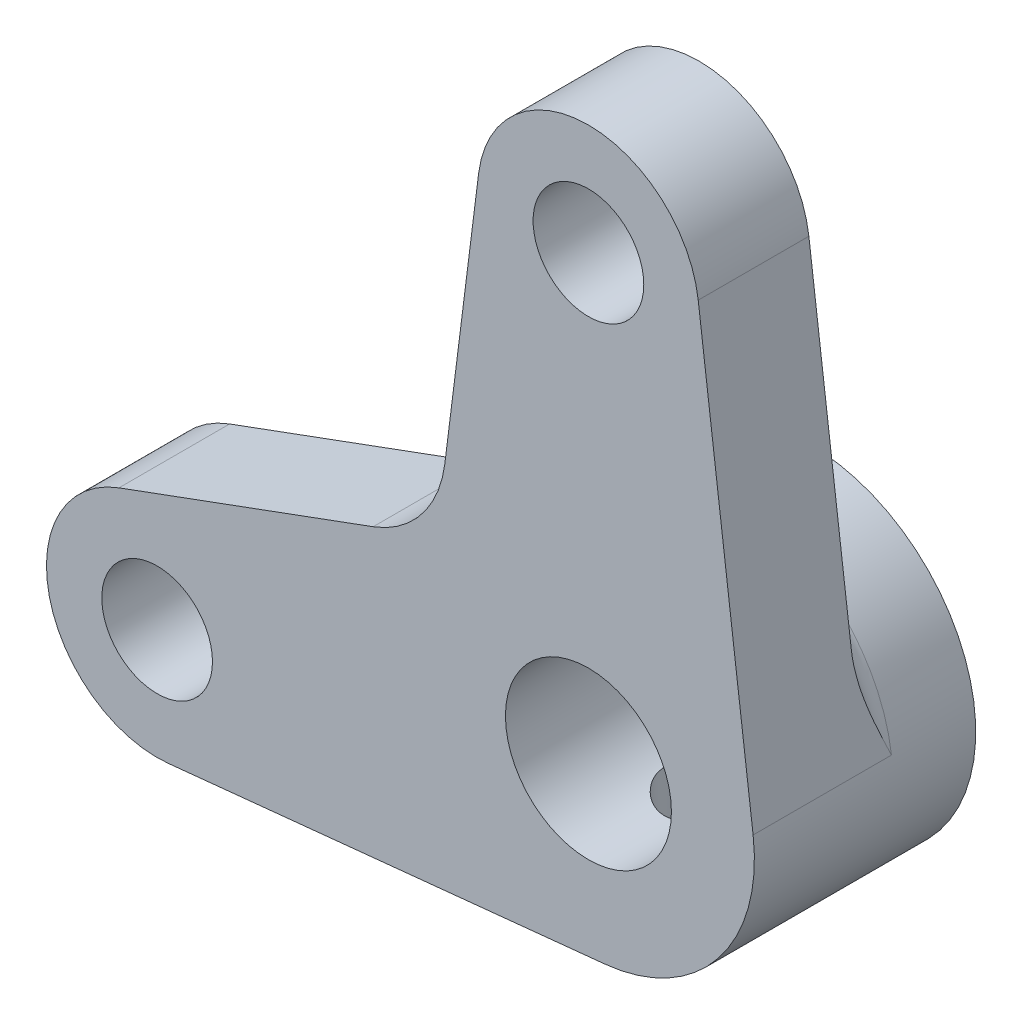
ISO-10303-21;
HEADER;
FILE_DESCRIPTION(('STEP AP214'),'2;1');
FILE_NAME('part.step','',(''),(''),'','','');
FILE_SCHEMA(('AUTOMOTIVE_DESIGN { 1 0 10303 214 1 1 1 1 }'));
ENDSEC;
DATA;
#1=APPLICATION_CONTEXT('core data for automotive mechanical design processes');
#2=APPLICATION_PROTOCOL_DEFINITION('international standard','automotive_design',2000,#1);
#3=PRODUCT_CONTEXT('',#1,'mechanical');
#4=PRODUCT('Part','Part','',(#3));
#5=PRODUCT_RELATED_PRODUCT_CATEGORY('part','',(#4));
#6=PRODUCT_DEFINITION_FORMATION('','',#4);
#7=PRODUCT_DEFINITION_CONTEXT('part definition',#1,'design');
#8=PRODUCT_DEFINITION('design','',#6,#7);
#9=PRODUCT_DEFINITION_SHAPE('','',#8);
#10=(LENGTH_UNIT() NAMED_UNIT(*) SI_UNIT(.MILLI.,.METRE.));
#11=(NAMED_UNIT(*) PLANE_ANGLE_UNIT() SI_UNIT($,.RADIAN.));
#12=(NAMED_UNIT(*) SI_UNIT($,.STERADIAN.) SOLID_ANGLE_UNIT());
#13=UNCERTAINTY_MEASURE_WITH_UNIT(LENGTH_MEASURE(1.E-05),#10,'distance_accuracy_value','');
#14=(GEOMETRIC_REPRESENTATION_CONTEXT(3) GLOBAL_UNCERTAINTY_ASSIGNED_CONTEXT((#13)) GLOBAL_UNIT_ASSIGNED_CONTEXT((#10,
#11,#12)) REPRESENTATION_CONTEXT('',''));
#15=CARTESIAN_POINT('',(0.,0.,0.));
#16=DIRECTION('',(0.,0.,1.));
#17=DIRECTION('',(1.,0.,0.));
#18=AXIS2_PLACEMENT_3D('',#15,#16,#17);
#19=CARTESIAN_POINT('',(-15.5899210365637,-3.5992168695019,4.));
#20=DIRECTION('',(0.,0.,1.));
#21=DIRECTION('',(1.,0.,0.));
#22=AXIS2_PLACEMENT_3D('',#19,#20,#21);
#23=PLANE('',#22);
#24=CARTESIAN_POINT('',(0.,0.,4.));
#25=DIRECTION('',(0.,0.,1.));
#26=DIRECTION('',(1.,0.,0.));
#27=AXIS2_PLACEMENT_3D('',#24,#25,#26);
#28=CIRCLE('',#27,3.);
#29=CARTESIAN_POINT('',(3.,0.,4.));
#30=VERTEX_POINT('',#29);
#31=EDGE_CURVE('E294',#30,#30,#28,.T.);
#32=ORIENTED_EDGE('',*,*,#31,.F.);
#33=EDGE_LOOP('',(#32));
#34=FACE_BOUND('',#33,.T.);
#35=CARTESIAN_POINT('',(-15.5899210365637,-3.5992168695019,4.));
#36=DIRECTION('',(0.,0.,1.));
#37=DIRECTION('',(1.,0.,0.));
#38=AXIS2_PLACEMENT_3D('',#35,#36,#37);
#39=CIRCLE('',#38,4.);
#40=CARTESIAN_POINT('',(-16.9698528893898,0.155218917877603,4.));
#41=VERTEX_POINT('',#40);
#42=CARTESIAN_POINT('',(-15.1843592485229,-7.57860371122527,4.));
#43=VERTEX_POINT('',#42);
#44=EDGE_CURVE('E254',#41,#43,#39,.T.);
#45=ORIENTED_EDGE('',*,*,#44,.T.);
#46=DIRECTION('',(0.994846710430843,0.101390447010215,0.));
#47=VECTOR('',#46,1.);
#48=CARTESIAN_POINT('',(-15.1843592485229,-7.57860371122527,4.));
#49=LINE('',#48,#47);
#50=CARTESIAN_POINT('',(0.60834268206129,-5.96908026258506,4.));
#51=VERTEX_POINT('',#50);
#52=EDGE_CURVE('E289',#43,#51,#49,.T.);
#53=ORIENTED_EDGE('',*,*,#52,.T.);
#54=CARTESIAN_POINT('',(0.,0.,4.));
#55=DIRECTION('',(0.,0.,1.));
#56=DIRECTION('',(1.,0.,0.));
#57=AXIS2_PLACEMENT_3D('',#54,#55,#56);
#58=CIRCLE('',#57,6.);
#59=CARTESIAN_POINT('',(5.95294044989533,0.75,4.));
#60=VERTEX_POINT('',#59);
#61=EDGE_CURVE('E138',#51,#60,#58,.T.);
#62=ORIENTED_EDGE('',*,*,#61,.T.);
#63=DIRECTION('',(-0.125,0.992156741649221,0.));
#64=VECTOR('',#63,1.);
#65=CARTESIAN_POINT('',(3.96862696659688,16.5,4.));
#66=LINE('',#65,#64);
#67=CARTESIAN_POINT('',(3.96862696659688,16.5,4.));
#68=VERTEX_POINT('',#67);
#69=EDGE_CURVE('E286',#60,#68,#66,.T.);
#70=ORIENTED_EDGE('',*,*,#69,.T.);
#71=CARTESIAN_POINT('',(0.,16.,4.));
#72=DIRECTION('',(0.,0.,1.));
#73=DIRECTION('',(1.,0.,0.));
#74=AXIS2_PLACEMENT_3D('',#71,#72,#73);
#75=CIRCLE('',#74,4.);
#76=CARTESIAN_POINT('',(-3.96862696659688,16.5,4.));
#77=VERTEX_POINT('',#76);
#78=EDGE_CURVE('E269',#68,#77,#75,.T.);
#79=ORIENTED_EDGE('',*,*,#78,.T.);
#80=DIRECTION('',(-0.125,-0.992156741649221,0.));
#81=VECTOR('',#80,1.);
#82=CARTESIAN_POINT('',(-3.96862696659688,16.5,4.));
#83=LINE('',#82,#81);
#84=CARTESIAN_POINT('',(-5.19235336997923,6.78697279160037,4.));
#85=VERTEX_POINT('',#84);
#86=EDGE_CURVE('E282',#77,#85,#83,.T.);
#87=ORIENTED_EDGE('',*,*,#86,.T.);
#88=CARTESIAN_POINT('',(-9.16098033657612,7.28697279160036,4.));
#89=DIRECTION('',(0.,0.,-1.));
#90=DIRECTION('',(-1.,0.,0.));
#91=AXIS2_PLACEMENT_3D('',#88,#89,#90);
#92=CIRCLE('',#91,4.);
#93=CARTESIAN_POINT('',(-7.78104848375004,3.53253700422085,4.));
#94=VERTEX_POINT('',#93);
#95=EDGE_CURVE('E279',#85,#94,#92,.T.);
#96=ORIENTED_EDGE('',*,*,#95,.T.);
#97=DIRECTION('',(-0.938608946844875,-0.344982963206524,0.));
#98=VECTOR('',#97,1.);
#99=CARTESIAN_POINT('',(-16.9698528893898,0.155218917877603,4.));
#100=LINE('',#99,#98);
#101=EDGE_CURVE('E242',#94,#41,#100,.T.);
#102=ORIENTED_EDGE('',*,*,#101,.T.);
#103=EDGE_LOOP('',(#45,#53,#62,#70,#79,#87,#96,#102));
#104=FACE_BOUND('',#103,.T.);
#105=CARTESIAN_POINT('',(-15.5899210365637,-3.5992168695019,4.));
#106=DIRECTION('',(0.,0.,1.));
#107=DIRECTION('',(1.,0.,0.));
#108=AXIS2_PLACEMENT_3D('',#105,#106,#107);
#109=CIRCLE('',#108,2.);
#110=CARTESIAN_POINT('',(-13.5899210365637,-3.5992168695019,4.));
#111=VERTEX_POINT('',#110);
#112=EDGE_CURVE('E234',#111,#111,#109,.T.);
#113=ORIENTED_EDGE('',*,*,#112,.F.);
#114=EDGE_LOOP('',(#113));
#115=FACE_BOUND('',#114,.T.);
#116=CARTESIAN_POINT('',(0.,16.,4.));
#117=DIRECTION('',(0.,0.,1.));
#118=DIRECTION('',(1.,0.,0.));
#119=AXIS2_PLACEMENT_3D('',#116,#117,#118);
#120=CIRCLE('',#119,2.);
#121=CARTESIAN_POINT('',(2.,16.,4.));
#122=VERTEX_POINT('',#121);
#123=EDGE_CURVE('E298',#122,#122,#120,.T.);
#124=ORIENTED_EDGE('',*,*,#123,.F.);
#125=EDGE_LOOP('',(#124));
#126=FACE_BOUND('',#125,.T.);
#127=ADVANCED_FACE('F36',(#34,#104,#115,#126),#23,.T.);
#128=CARTESIAN_POINT('',(-15.5899210365637,-3.5992168695019,0.));
#129=DIRECTION('',(0.,0.,1.));
#130=DIRECTION('',(1.,0.,0.));
#131=AXIS2_PLACEMENT_3D('',#128,#129,#130);
#132=PLANE('',#131);
#133=DIRECTION('',(-0.125,0.992156741649221,0.));
#134=VECTOR('',#133,1.);
#135=CARTESIAN_POINT('',(3.96862696659688,16.5,0.));
#136=LINE('',#135,#134);
#137=CARTESIAN_POINT('',(5.50224654046233,4.32727200531355,0.));
#138=VERTEX_POINT('',#137);
#139=CARTESIAN_POINT('',(3.96862696659688,16.5,0.));
#140=VERTEX_POINT('',#139);
#141=EDGE_CURVE('E236',#138,#140,#136,.T.);
#142=ORIENTED_EDGE('',*,*,#141,.F.);
#143=CARTESIAN_POINT('',(0.,0.,0.));
#144=DIRECTION('',(0.,0.,1.));
#145=DIRECTION('',(1.,0.,0.));
#146=AXIS2_PLACEMENT_3D('',#143,#144,#145);
#147=CIRCLE('',#146,7.);
#148=CARTESIAN_POINT('',(-2.97862814362378,-6.3346487181226,0.));
#149=VERTEX_POINT('',#148);
#150=EDGE_CURVE('E213',#138,#149,#147,.T.);
#151=ORIENTED_EDGE('',*,*,#150,.T.);
#152=DIRECTION('',(0.994846710430843,0.101390447010215,0.));
#153=VECTOR('',#152,1.);
#154=CARTESIAN_POINT('',(-15.1843592485229,-7.57860371122527,0.));
#155=LINE('',#154,#153);
#156=CARTESIAN_POINT('',(-15.1843592485229,-7.57860371122527,0.));
#157=VERTEX_POINT('',#156);
#158=EDGE_CURVE('E233',#157,#149,#155,.T.);
#159=ORIENTED_EDGE('',*,*,#158,.F.);
#160=CARTESIAN_POINT('',(-15.5899210365637,-3.5992168695019,0.));
#161=DIRECTION('',(0.,0.,1.));
#162=DIRECTION('',(1.,0.,0.));
#163=AXIS2_PLACEMENT_3D('',#160,#161,#162);
#164=CIRCLE('',#163,4.);
#165=CARTESIAN_POINT('',(-16.9698528893898,0.155218917877603,0.));
#166=VERTEX_POINT('',#165);
#167=EDGE_CURVE('E228',#166,#157,#164,.T.);
#168=ORIENTED_EDGE('',*,*,#167,.F.);
#169=DIRECTION('',(-0.938608946844875,-0.344982963206524,0.));
#170=VECTOR('',#169,1.);
#171=CARTESIAN_POINT('',(-16.9698528893898,0.155218917877603,0.));
#172=LINE('',#171,#170);
#173=CARTESIAN_POINT('',(-7.78104848375004,3.53253700422085,0.));
#174=VERTEX_POINT('',#173);
#175=EDGE_CURVE('E252',#174,#166,#172,.T.);
#176=ORIENTED_EDGE('',*,*,#175,.F.);
#177=CARTESIAN_POINT('',(-9.16098033657612,7.28697279160036,0.));
#178=DIRECTION('',(0.,0.,-1.));
#179=DIRECTION('',(-1.,0.,0.));
#180=AXIS2_PLACEMENT_3D('',#177,#178,#179);
#181=CIRCLE('',#180,4.);
#182=CARTESIAN_POINT('',(-5.19235336997923,6.78697279160037,0.));
#183=VERTEX_POINT('',#182);
#184=EDGE_CURVE('E250',#183,#174,#181,.T.);
#185=ORIENTED_EDGE('',*,*,#184,.F.);
#186=DIRECTION('',(-0.125,-0.992156741649221,0.));
#187=VECTOR('',#186,1.);
#188=CARTESIAN_POINT('',(-3.96862696659688,16.5,0.));
#189=LINE('',#188,#187);
#190=CARTESIAN_POINT('',(-3.96862696659688,16.5,0.));
#191=VERTEX_POINT('',#190);
#192=EDGE_CURVE('E248',#191,#183,#189,.T.);
#193=ORIENTED_EDGE('',*,*,#192,.F.);
#194=CARTESIAN_POINT('',(0.,16.,0.));
#195=DIRECTION('',(0.,0.,1.));
#196=DIRECTION('',(1.,0.,0.));
#197=AXIS2_PLACEMENT_3D('',#194,#195,#196);
#198=CIRCLE('',#197,4.);
#199=EDGE_CURVE('E246',#140,#191,#198,.T.);
#200=ORIENTED_EDGE('',*,*,#199,.F.);
#201=EDGE_LOOP('',(#142,#151,#159,#168,#176,#185,#193,#200));
#202=FACE_BOUND('',#201,.T.);
#203=CARTESIAN_POINT('',(-15.5899210365637,-3.5992168695019,0.));
#204=DIRECTION('',(0.,0.,1.));
#205=DIRECTION('',(1.,0.,0.));
#206=AXIS2_PLACEMENT_3D('',#203,#204,#205);
#207=CIRCLE('',#206,2.);
#208=CARTESIAN_POINT('',(-13.5899210365637,-3.5992168695019,0.));
#209=VERTEX_POINT('',#208);
#210=EDGE_CURVE('E239',#209,#209,#207,.T.);
#211=ORIENTED_EDGE('',*,*,#210,.T.);
#212=EDGE_LOOP('',(#211));
#213=FACE_BOUND('',#212,.T.);
#214=CARTESIAN_POINT('',(0.,16.,0.));
#215=DIRECTION('',(0.,0.,1.));
#216=DIRECTION('',(1.,0.,0.));
#217=AXIS2_PLACEMENT_3D('',#214,#215,#216);
#218=CIRCLE('',#217,2.);
#219=CARTESIAN_POINT('',(2.,16.,0.));
#220=VERTEX_POINT('',#219);
#221=EDGE_CURVE('E299',#220,#220,#218,.T.);
#222=ORIENTED_EDGE('',*,*,#221,.T.);
#223=EDGE_LOOP('',(#222));
#224=FACE_BOUND('',#223,.T.);
#225=ADVANCED_FACE('F185',(#202,#213,#224),#132,.F.);
#226=CARTESIAN_POINT('',(-15.5899210365637,-3.5992168695019,4.));
#227=DIRECTION('',(0.,0.,-1.));
#228=DIRECTION('',(-1.,0.,0.));
#229=AXIS2_PLACEMENT_3D('',#226,#227,#228);
#230=CYLINDRICAL_SURFACE('',#229,4.);
#231=ORIENTED_EDGE('',*,*,#167,.T.);
#232=DIRECTION('',(0.,0.,-1.));
#233=VECTOR('',#232,1.);
#234=CARTESIAN_POINT('',(-15.1843592485229,-7.57860371122527,4.));
#235=LINE('',#234,#233);
#236=EDGE_CURVE('E124',#43,#157,#235,.T.);
#237=ORIENTED_EDGE('',*,*,#236,.F.);
#238=ORIENTED_EDGE('',*,*,#44,.F.);
#239=DIRECTION('',(0.,0.,-1.));
#240=VECTOR('',#239,1.);
#241=CARTESIAN_POINT('',(-16.9698528893898,0.155218917877603,4.));
#242=LINE('',#241,#240);
#243=EDGE_CURVE('E231',#41,#166,#242,.T.);
#244=ORIENTED_EDGE('',*,*,#243,.T.);
#245=EDGE_LOOP('',(#231,#237,#238,#244));
#246=FACE_BOUND('',#245,.T.);
#247=ADVANCED_FACE('F189',(#246),#230,.T.);
#248=CARTESIAN_POINT('',(-15.1843592485229,-7.57860371122527,4.));
#249=DIRECTION('',(-0.101390447010215,0.994846710430843,0.));
#250=DIRECTION('',(-0.994846710430843,-0.101390447010215,0.));
#251=AXIS2_PLACEMENT_3D('',#248,#249,#250);
#252=PLANE('',#251);
#253=ORIENTED_EDGE('',*,*,#158,.T.);
#254=CARTESIAN_POINT('',(-2.97862814362378,-6.3346487181226,0.));
#255=CARTESIAN_POINT('',(-2.90308294799251,-6.32694948056749,-1.56209985693339E-05));
#256=CARTESIAN_POINT('',(-2.8275688274235,-6.31925341004748,-0.00229374645395398));
#257=CARTESIAN_POINT('',(-2.67681403400505,-6.30388913760896,-0.01085341015607));
#258=CARTESIAN_POINT('',(-2.60157320678209,-6.29622091995736,-0.0171321458043487));
#259=CARTESIAN_POINT('',(-2.45187039275266,-6.2809638606798,-0.0331301338563641));
#260=CARTESIAN_POINT('',(-2.37740639231187,-6.27337481383299,-0.0428308585833424));
#261=CARTESIAN_POINT('',(-2.228924484977,-6.25824218405217,-0.0652627946849682));
#262=CARTESIAN_POINT('',(-2.15490666131349,-6.25069860960067,-0.0779945545678533));
#263=CARTESIAN_POINT('',(-1.93427000150934,-6.22821228147611,-0.12004284567006));
#264=CARTESIAN_POINT('',(-1.78838482640824,-6.21334429934321,-0.15329246027527));
#265=CARTESIAN_POINT('',(-1.57075541785353,-6.191164457178,-0.209314468864952));
#266=CARTESIAN_POINT('',(-1.49820999541681,-6.18377094345143,-0.229077294990475));
#267=CARTESIAN_POINT('',(-1.35365131716599,-6.1690381521044,-0.270382961007596));
#268=CARTESIAN_POINT('',(-1.28163786869547,-6.16169885484924,-0.29192511821995));
#269=CARTESIAN_POINT('',(-1.20985768307441,-6.1543833307285,-0.314236195728357));
#270=B_SPLINE_CURVE_WITH_KNOTS('',3,(#254,#255,#256,#257,#258,#259,#260,#261,#262,#263,#264,
#265,#266,#267,#268,#269),.UNSPECIFIED.,.F.,.F.,(4,2,2,2,2,2,2,4),(0.,0.227731108736886,
0.45530285723825,0.681660911877761,0.908059960354492,1.35878919478755,1.58543029179668,
1.81198483335537),.UNSPECIFIED.);
#271=CARTESIAN_POINT('',(-1.20985768307441,-6.1543833307285,-0.314236195728356));
#272=VERTEX_POINT('',#271);
#273=EDGE_CURVE('E50',#149,#272,#270,.T.);
#274=ORIENTED_EDGE('',*,*,#273,.T.);
#275=CARTESIAN_POINT('',(0.,-6.03107990114533,0.));
#276=DIRECTION('',(-0.101390447010215,0.994846710430843,0.));
#277=DIRECTION('',(-0.994846710430843,-0.101390447010215,0.));
#278=AXIS2_PLACEMENT_3D('',#275,#276,#277);
#279=ELLIPSE('',#278,1.25647497940528,1.25);
#280=CARTESIAN_POINT('',(0.60834268206129,-5.96908026258506,1.09197947837058));
#281=VERTEX_POINT('',#280);
#282=EDGE_CURVE('E56',#272,#281,#279,.T.);
#283=ORIENTED_EDGE('',*,*,#282,.T.);
#284=DIRECTION('',(0.,0.,-1.));
#285=VECTOR('',#284,1.);
#286=CARTESIAN_POINT('',(0.60834268206129,-5.96908026258506,4.));
#287=LINE('',#286,#285);
#288=EDGE_CURVE('E130',#51,#281,#287,.T.);
#289=ORIENTED_EDGE('',*,*,#288,.F.);
#290=ORIENTED_EDGE('',*,*,#52,.F.);
#291=ORIENTED_EDGE('',*,*,#236,.T.);
#292=EDGE_LOOP('',(#253,#274,#283,#289,#290,#291));
#293=FACE_BOUND('',#292,.T.);
#294=ADVANCED_FACE('F129',(#293),#252,.F.);
#295=CARTESIAN_POINT('',(0.,0.,4.));
#296=DIRECTION('',(0.,0.,-1.));
#297=DIRECTION('',(-1.,0.,0.));
#298=AXIS2_PLACEMENT_3D('',#295,#296,#297);
#299=CYLINDRICAL_SURFACE('',#298,6.);
#300=CARTESIAN_POINT('',(0.,-6.,-1.25));
#301=CARTESIAN_POINT('',(-0.0694090417016606,-5.99999871526651,-1.24999752253078));
#302=CARTESIAN_POINT('',(-0.138848789520875,-5.99878328775043,-1.24419933428125));
#303=CARTESIAN_POINT('',(-0.275761316266993,-5.9940520099068,-1.22118065046715));
#304=CARTESIAN_POINT('',(-0.343232560128313,-5.99053441189248,-1.20395147696307));
#305=CARTESIAN_POINT('',(-0.474209132291342,-5.98159109196202,-1.15862954507818));
#306=CARTESIAN_POINT('',(-0.537718336709184,-5.97616727052645,-1.13054760400111));
#307=CARTESIAN_POINT('',(-0.659120328605958,-5.96399927809859,-1.06435039114382));
#308=CARTESIAN_POINT('',(-0.717013367534327,-5.95725516625975,-1.02623556884417));
#309=CARTESIAN_POINT('',(-0.826390324308836,-5.94307700024651,-0.940463659809355));
#310=CARTESIAN_POINT('',(-0.877780244162685,-5.93563505848532,-0.892687998764919));
#311=CARTESIAN_POINT('',(-0.971877776769392,-5.92095657692448,-0.78920534080489));
#312=CARTESIAN_POINT('',(-1.01458467096099,-5.91372005416683,-0.733497688127736));
#313=CARTESIAN_POINT('',(-1.09051031677217,-5.90019442595308,-0.615048031233842));
#314=CARTESIAN_POINT('',(-1.12363054680651,-5.89391545174828,-0.552241615497257));
#315=CARTESIAN_POINT('',(-1.17881119348064,-5.8831284065002,-0.421802548227245));
#316=CARTESIAN_POINT('',(-1.20087280167641,-5.87862014467568,-0.354170417557464));
#317=CARTESIAN_POINT('',(-1.23300240133737,-5.87196500986123,-0.217014762584362));
#318=CARTESIAN_POINT('',(-1.24323597696799,-5.86978556855866,-0.147531640665234));
#319=CARTESIAN_POINT('',(-1.25193357655615,-5.86793690716491,-0.00780315713736862));
#320=CARTESIAN_POINT('',(-1.25039890894687,-5.86826740800981,0.0624421188652958));
#321=CARTESIAN_POINT('',(-1.23573719037197,-5.87137174319175,0.200481027975176));
#322=CARTESIAN_POINT('',(-1.2228010523272,-5.87410533679901,0.268295979661212));
#323=CARTESIAN_POINT('',(-1.18600543529945,-5.88164437615942,0.400771509644927));
#324=CARTESIAN_POINT('',(-1.16214539481382,-5.88644992841317,0.465431925606331));
#325=CARTESIAN_POINT('',(-1.10400003213928,-5.89763191464102,0.590307228415981));
#326=CARTESIAN_POINT('',(-1.06964002534237,-5.90401953785586,0.650486296527073));
#327=CARTESIAN_POINT('',(-0.991522699274818,-5.91763890010721,0.76429574426816));
#328=CARTESIAN_POINT('',(-0.947764212262588,-5.92487074398537,0.817925308835976));
#329=CARTESIAN_POINT('',(-0.851074921546783,-5.93953730929909,0.918213961080372));
#330=CARTESIAN_POINT('',(-0.797981433412082,-5.94697323199474,0.964716168897013));
#331=CARTESIAN_POINT('',(-0.684667288611798,-5.96108088143001,1.04818044222897));
#332=CARTESIAN_POINT('',(-0.624446525025765,-5.96775259670236,1.0851423645984));
#333=CARTESIAN_POINT('',(-0.498405541235478,-5.97959870942815,1.14851008153595));
#334=CARTESIAN_POINT('',(-0.432575461926499,-5.98477039710258,1.17489680456712));
#335=CARTESIAN_POINT('',(-0.297284620972155,-5.99301338211281,1.21619170483549));
#336=CARTESIAN_POINT('',(-0.227824338595089,-5.99608495596053,1.2311013932314));
#337=CARTESIAN_POINT('',(-0.0885918657008349,-5.99974275215456,1.24879425206789));
#338=CARTESIAN_POINT('',(-0.0188480555261784,-6.00037293537579,1.25179194149425));
#339=CARTESIAN_POINT('',(0.120143798757715,-5.99919952252774,1.2461550500309));
#340=CARTESIAN_POINT('',(0.189391872962258,-5.99739607548153,1.2375211813984));
#341=CARTESIAN_POINT('',(0.324726367119813,-5.99158564979184,1.20904434653047));
#342=CARTESIAN_POINT('',(0.390837192894206,-5.98760052868077,1.18931251461653));
#343=CARTESIAN_POINT('',(0.518811446661331,-5.97787227242395,1.13932213957859));
#344=CARTESIAN_POINT('',(0.580674536336775,-5.97212899744579,1.10906275913402));
#345=CARTESIAN_POINT('',(0.699294306943494,-5.95941241490714,1.03841962176244));
#346=CARTESIAN_POINT('',(0.755973219469834,-5.9524239381233,0.997908070430938));
#347=CARTESIAN_POINT('',(0.86180544588652,-5.93802568299709,0.908080436923728));
#348=CARTESIAN_POINT('',(0.910957877913286,-5.93061585542511,0.858763324481059));
#349=CARTESIAN_POINT('',(1.0011786486518,-5.91606024531377,0.7517444230003));
#350=CARTESIAN_POINT('',(1.04209914600204,-5.90892089307501,0.693916968044719));
#351=CARTESIAN_POINT('',(1.11364719079243,-5.89585601015806,0.572083715786214));
#352=CARTESIAN_POINT('',(1.14427516677864,-5.88993042894651,0.508078175860894));
#353=CARTESIAN_POINT('',(1.19417246443922,-5.88001700708041,0.376038803701768));
#354=CARTESIAN_POINT('',(1.21350309828032,-5.87601872784687,0.308028962834163));
#355=CARTESIAN_POINT('',(1.24044038523407,-5.87039184709697,0.169633449507739));
#356=CARTESIAN_POINT('',(1.24804871544441,-5.86876290660367,0.0992481183805586));
#357=CARTESIAN_POINT('',(1.25125926487611,-5.86807907308506,-0.040413400999648));
#358=CARTESIAN_POINT('',(1.24709542622725,-5.86897402321502,-0.109684070222055));
#359=CARTESIAN_POINT('',(1.22739905314032,-5.87312447254928,-0.246514008920219));
#360=CARTESIAN_POINT('',(1.21186662782266,-5.87637994909626,-0.314073294816106));
#361=CARTESIAN_POINT('',(1.16998217768585,-5.88486132447716,-0.445397771890661));
#362=CARTESIAN_POINT('',(1.14366117568421,-5.8900815700793,-0.509173246486927));
#363=CARTESIAN_POINT('',(1.08097457299757,-5.90190705738738,-0.631438776026666));
#364=CARTESIAN_POINT('',(1.0446080398303,-5.9085124276546,-0.689928339633126));
#365=CARTESIAN_POINT('',(0.96207369534241,-5.92251579551146,-0.801121627079445));
#366=CARTESIAN_POINT('',(0.915737890418225,-5.92992613868404,-0.853699124564985));
#367=CARTESIAN_POINT('',(0.814924438115334,-5.94461839583213,-0.950409493226359));
#368=CARTESIAN_POINT('',(0.760444918832967,-5.9519002798488,-0.994540417551485));
#369=CARTESIAN_POINT('',(0.644134427507702,-5.96561444547638,-1.07358857318406));
#370=CARTESIAN_POINT('',(0.582225921521348,-5.97203596073244,-1.10839367988629));
#371=CARTESIAN_POINT('',(0.453319843998453,-5.98319908494092,-1.16705022843002));
#372=CARTESIAN_POINT('',(0.386326781907243,-5.98794216182101,-1.19091124718188));
#373=CARTESIAN_POINT('',(0.266015292900104,-5.99432499781444,-1.22254027828842));
#374=CARTESIAN_POINT('',(0.213367593727928,-5.99644035661395,-1.23281876320886));
#375=CARTESIAN_POINT('',(0.107152674176537,-5.99927832789758,-1.24654945427733));
#376=CARTESIAN_POINT('',(0.0535854878488716,-6.00000099184586,-1.25000191266719));
#377=CARTESIAN_POINT('',(0.,-6.,-1.25));
#378=B_SPLINE_CURVE_WITH_KNOTS('',3,(#300,#301,#302,#303,#304,#305,#306,#307,#308,#309,#310,
#311,#312,#313,#314,#315,#316,#317,#318,#319,#320,#321,#322,#323,#324,#325,#326,#327,#328,#329,
#330,#331,#332,#333,#334,#335,#336,#337,#338,#339,#340,#341,#342,#343,#344,#345,#346,#347,#348,
#349,#350,#351,#352,#353,#354,#355,#356,#357,#358,#359,#360,#361,#362,#363,#364,#365,#366,#367,
#368,#369,#370,#371,#372,#373,#374,#375,#376,#377),.UNSPECIFIED.,.T.,.F.,(4,2,2,2,2,2,2,2,2,2,2,
2,2,2,2,2,2,2,2,2,2,2,2,2,2,2,2,2,2,2,2,2,2,2,2,2,2,2,4),(0.,0.208031045103183,
0.416220199906225,0.624202378825442,0.83217524157299,1.04287526388123,1.25359271551786,
1.46640449178548,1.6791933328549,1.88896575169854,2.09871484767164,2.30501712129059,
2.5113300003028,2.71914592416749,2.92698768368034,3.13889526355466,3.35080602278218,
3.56309724499662,3.77536051045771,3.98378339407675,4.19219351552277,4.39855286632621,
4.60492863390933,4.81401583995737,5.02312752564574,5.23571263829336,5.44828889851309,
5.65970050095025,5.87108185414185,6.07829223291038,6.28550062281361,6.49211731393255,
6.6987531908148,6.90919024830309,7.11967575117369,7.33258864398256,7.54531486464973,
7.7059258847728,7.86653096973391),.UNSPECIFIED.);
#379=CARTESIAN_POINT('',(-0.749999999999999,-5.95294044989533,-1.));
#380=VERTEX_POINT('',#379);
#381=EDGE_CURVE('E116',#281,#380,#378,.T.);
#382=ORIENTED_EDGE('',*,*,#381,.T.);
#383=CARTESIAN_POINT('',(0.,0.,-1.));
#384=DIRECTION('',(0.,0.,1.));
#385=DIRECTION('',(1.,0.,0.));
#386=AXIS2_PLACEMENT_3D('',#383,#384,#385);
#387=CIRCLE('',#386,6.);
#388=CARTESIAN_POINT('',(5.95294044989533,0.75,-1.));
#389=VERTEX_POINT('',#388);
#390=EDGE_CURVE('E123',#380,#389,#387,.F.);
#391=ORIENTED_EDGE('',*,*,#390,.T.);
#392=DIRECTION('',(0.,0.,-1.));
#393=VECTOR('',#392,1.);
#394=CARTESIAN_POINT('',(5.95294044989533,0.75,4.));
#395=LINE('',#394,#393);
#396=EDGE_CURVE('E139',#60,#389,#395,.T.);
#397=ORIENTED_EDGE('',*,*,#396,.F.);
#398=ORIENTED_EDGE('',*,*,#61,.F.);
#399=ORIENTED_EDGE('',*,*,#288,.T.);
#400=EDGE_LOOP('',(#382,#391,#397,#398,#399));
#401=FACE_BOUND('',#400,.T.);
#402=CARTESIAN_POINT('',(0.,0.,-4.));
#403=DIRECTION('',(0.,0.,-1.));
#404=DIRECTION('',(-1.,0.,0.));
#405=AXIS2_PLACEMENT_3D('',#402,#403,#404);
#406=CIRCLE('',#405,6.);
#407=CARTESIAN_POINT('',(-6.,0.,-4.));
#408=VERTEX_POINT('',#407);
#409=EDGE_CURVE('E302',#408,#408,#406,.T.);
#410=ORIENTED_EDGE('',*,*,#409,.F.);
#411=EDGE_LOOP('',(#410));
#412=FACE_BOUND('',#411,.T.);
#413=ADVANCED_FACE('F135',(#401,#412),#299,.T.);
#414=CARTESIAN_POINT('',(3.96862696659688,16.5,4.));
#415=DIRECTION('',(-0.992156741649222,-0.125,0.));
#416=DIRECTION('',(0.125,-0.992156741649222,0.));
#417=AXIS2_PLACEMENT_3D('',#414,#415,#416);
#418=PLANE('',#417);
#419=ORIENTED_EDGE('',*,*,#396,.T.);
#420=CARTESIAN_POINT('',(5.50224654046233,4.32727200531355,0.));
#421=CARTESIAN_POINT('',(5.51101872447031,4.25764495329355,-1.03645923924594E-05));
#422=CARTESIAN_POINT('',(5.51978733573018,4.18804625908248,-0.00195841567592837));
#423=CARTESIAN_POINT('',(5.53729713989605,4.0490664970975,-0.0093085541482495));
#424=CARTESIAN_POINT('',(5.5460383459385,3.97968532505612,-0.014708600549357));
#425=CARTESIAN_POINT('',(5.57215639023643,3.77237977522507,-0.0354199337015101));
#426=CARTESIAN_POINT('',(5.58947771422694,3.63489602825327,-0.0552472975549433));
#427=CARTESIAN_POINT('',(5.6237361393593,3.36297820862643,-0.104117779562431));
#428=CARTESIAN_POINT('',(5.64067532913308,3.22852755796938,-0.133071248395667));
#429=CARTESIAN_POINT('',(5.67434317941299,2.96129728091303,-0.19829796886114));
#430=CARTESIAN_POINT('',(5.69107165994492,2.8285190830146,-0.234577079507031));
#431=CARTESIAN_POINT('',(5.72843118365453,2.53198705650824,-0.322485157429789));
#432=CARTESIAN_POINT('',(5.74900354889906,2.36869896955596,-0.375690988309577));
#433=CARTESIAN_POINT('',(5.78988281402752,2.044229861629,-0.488312861481181));
#434=CARTESIAN_POINT('',(5.81018963701811,1.88304945097628,-0.547730659655971));
#435=CARTESIAN_POINT('',(5.87090854551017,1.40110805572845,-0.732162763038526));
#436=CARTESIAN_POINT('',(5.91103336709418,1.08262715779207,-0.863133177715885));
#437=CARTESIAN_POINT('',(5.95174522237121,0.759486824366867,-0.996096416026432));
#438=CARTESIAN_POINT('',(5.95234283669284,0.754743407742006,-0.998048216503132));
#439=CARTESIAN_POINT('',(5.95294044989533,0.75,-1.));
#440=B_SPLINE_CURVE_WITH_KNOTS('',3,(#420,#421,#422,#423,#424,#425,#426,#427,#428,#429,#430,
#431,#432,#433,#434,#435,#436,#437,#438,#439),.UNSPECIFIED.,.F.,.F.,(4,2,2,2,2,2,2,2,2,4),(0.,
0.21046171017357,0.420799100084848,0.840276954520434,1.25575620368651,1.67156907683587,
2.19028026685882,2.70913847493547,3.74901427320918,3.76450620659406),.UNSPECIFIED.);
#441=EDGE_CURVE('E64',#389,#138,#440,.F.);
#442=ORIENTED_EDGE('',*,*,#441,.T.);
#443=ORIENTED_EDGE('',*,*,#141,.T.);
#444=DIRECTION('',(0.,0.,-1.));
#445=VECTOR('',#444,1.);
#446=CARTESIAN_POINT('',(3.96862696659688,16.5,4.));
#447=LINE('',#446,#445);
#448=EDGE_CURVE('E143',#68,#140,#447,.T.);
#449=ORIENTED_EDGE('',*,*,#448,.F.);
#450=ORIENTED_EDGE('',*,*,#69,.F.);
#451=EDGE_LOOP('',(#419,#442,#443,#449,#450));
#452=FACE_BOUND('',#451,.T.);
#453=ADVANCED_FACE('F204',(#452),#418,.F.);
#454=CARTESIAN_POINT('',(0.,16.,4.));
#455=DIRECTION('',(0.,0.,-1.));
#456=DIRECTION('',(-1.,0.,0.));
#457=AXIS2_PLACEMENT_3D('',#454,#455,#456);
#458=CYLINDRICAL_SURFACE('',#457,4.);
#459=ORIENTED_EDGE('',*,*,#199,.T.);
#460=DIRECTION('',(0.,0.,-1.));
#461=VECTOR('',#460,1.);
#462=CARTESIAN_POINT('',(-3.96862696659688,16.5,4.));
#463=LINE('',#462,#461);
#464=EDGE_CURVE('E262',#77,#191,#463,.T.);
#465=ORIENTED_EDGE('',*,*,#464,.F.);
#466=ORIENTED_EDGE('',*,*,#78,.F.);
#467=ORIENTED_EDGE('',*,*,#448,.T.);
#468=EDGE_LOOP('',(#459,#465,#466,#467));
#469=FACE_BOUND('',#468,.T.);
#470=ADVANCED_FACE('F201',(#469),#458,.T.);
#471=CARTESIAN_POINT('',(-3.96862696659688,16.5,4.));
#472=DIRECTION('',(0.992156741649222,-0.125,0.));
#473=DIRECTION('',(0.125,0.992156741649222,0.));
#474=AXIS2_PLACEMENT_3D('',#471,#472,#473);
#475=PLANE('',#474);
#476=ORIENTED_EDGE('',*,*,#192,.T.);
#477=DIRECTION('',(0.,0.,-1.));
#478=VECTOR('',#477,1.);
#479=CARTESIAN_POINT('',(-5.19235336997923,6.78697279160037,4.));
#480=LINE('',#479,#478);
#481=EDGE_CURVE('E259',#85,#183,#480,.T.);
#482=ORIENTED_EDGE('',*,*,#481,.F.);
#483=ORIENTED_EDGE('',*,*,#86,.F.);
#484=ORIENTED_EDGE('',*,*,#464,.T.);
#485=EDGE_LOOP('',(#476,#482,#483,#484));
#486=FACE_BOUND('',#485,.T.);
#487=ADVANCED_FACE('F197',(#486),#475,.F.);
#488=CARTESIAN_POINT('',(-9.16098033657612,7.28697279160036,4.));
#489=DIRECTION('',(0.,0.,-1.));
#490=DIRECTION('',(-1.,0.,0.));
#491=AXIS2_PLACEMENT_3D('',#488,#489,#490);
#492=CYLINDRICAL_SURFACE('',#491,4.);
#493=ORIENTED_EDGE('',*,*,#184,.T.);
#494=DIRECTION('',(0.,0.,-1.));
#495=VECTOR('',#494,1.);
#496=CARTESIAN_POINT('',(-7.78104848375004,3.53253700422085,4.));
#497=LINE('',#496,#495);
#498=EDGE_CURVE('E256',#94,#174,#497,.T.);
#499=ORIENTED_EDGE('',*,*,#498,.F.);
#500=ORIENTED_EDGE('',*,*,#95,.F.);
#501=ORIENTED_EDGE('',*,*,#481,.T.);
#502=EDGE_LOOP('',(#493,#499,#500,#501));
#503=FACE_BOUND('',#502,.T.);
#504=ADVANCED_FACE('F193',(#503),#492,.F.);
#505=CARTESIAN_POINT('',(-16.9698528893898,0.155218917877603,4.));
#506=DIRECTION('',(0.344982963206524,-0.938608946844875,0.));
#507=DIRECTION('',(0.938608946844876,0.344982963206524,0.));
#508=AXIS2_PLACEMENT_3D('',#505,#506,#507);
#509=PLANE('',#508);
#510=ORIENTED_EDGE('',*,*,#175,.T.);
#511=ORIENTED_EDGE('',*,*,#243,.F.);
#512=ORIENTED_EDGE('',*,*,#101,.F.);
#513=ORIENTED_EDGE('',*,*,#498,.T.);
#514=EDGE_LOOP('',(#510,#511,#512,#513));
#515=FACE_BOUND('',#514,.T.);
#516=ADVANCED_FACE('F181',(#515),#509,.F.);
#517=CARTESIAN_POINT('',(-15.5899210365637,-3.5992168695019,4.));
#518=DIRECTION('',(0.,0.,-1.));
#519=DIRECTION('',(-1.,0.,0.));
#520=AXIS2_PLACEMENT_3D('',#517,#518,#519);
#521=CYLINDRICAL_SURFACE('',#520,2.);
#522=ORIENTED_EDGE('',*,*,#112,.T.);
#523=EDGE_LOOP('',(#522));
#524=FACE_BOUND('',#523,.T.);
#525=ORIENTED_EDGE('',*,*,#210,.F.);
#526=EDGE_LOOP('',(#525));
#527=FACE_BOUND('',#526,.T.);
#528=ADVANCED_FACE('F177',(#524,#527),#521,.F.);
#529=CARTESIAN_POINT('',(0.,0.,4.));
#530=DIRECTION('',(0.,0.,-1.));
#531=DIRECTION('',(-1.,0.,0.));
#532=AXIS2_PLACEMENT_3D('',#529,#530,#531);
#533=CYLINDRICAL_SURFACE('',#532,3.);
#534=CARTESIAN_POINT('',(0.,-3.,-1.25));
#535=CARTESIAN_POINT('',(-0.0669580526362668,-2.99999458367273,-1.2499927949087));
#536=CARTESIAN_POINT('',(-0.134021397063841,-2.9977323297471,-1.24458804147187));
#537=CARTESIAN_POINT('',(-0.266247371156347,-2.98890153579552,-1.22316093507982));
#538=CARTESIAN_POINT('',(-0.331404576423564,-2.98232175901028,-1.20711087553575));
#539=CARTESIAN_POINT('',(-0.457688733653088,-2.96556289038127,-1.16508890821941));
#540=CARTESIAN_POINT('',(-0.518828524426269,-2.95539599975004,-1.13915061053185));
#541=CARTESIAN_POINT('',(-0.635829756679802,-2.93245286470664,-1.07822717676743));
#542=CARTESIAN_POINT('',(-0.691692790015939,-2.91967741092849,-1.04324478102913));
#543=CARTESIAN_POINT('',(-0.799448403559512,-2.89207828351869,-0.96337101740912));
#544=CARTESIAN_POINT('',(-0.851041267517768,-2.87718753326093,-0.918098691210248));
#545=CARTESIAN_POINT('',(-0.946159821091262,-2.84732714068514,-0.81973566521743));
#546=CARTESIAN_POINT('',(-0.989681263153085,-2.83235746106809,-0.766640875105494));
#547=CARTESIAN_POINT('',(-1.06953737697065,-2.80321021812995,-0.650973222435105));
#548=CARTESIAN_POINT('',(-1.10541308153925,-2.78910786873385,-0.588062551573456));
#549=CARTESIAN_POINT('',(-1.16593940588866,-2.76435572357005,-0.45642674207907));
#550=CARTESIAN_POINT('',(-1.19059580836291,-2.75370415000823,-0.387704620515548));
#551=CARTESIAN_POINT('',(-1.22674598312159,-2.73778555387705,-0.249846308232079));
#552=CARTESIAN_POINT('',(-1.23881657877606,-2.73228387651787,-0.180889516607846));
#553=CARTESIAN_POINT('',(-1.25125209967796,-2.72661326219504,-0.0417267073134293));
#554=CARTESIAN_POINT('',(-1.25162348054397,-2.7264413842526,0.02847860002574));
#555=CARTESIAN_POINT('',(-1.24108450363674,-2.73125119560853,0.162400060434938));
#556=CARTESIAN_POINT('',(-1.23103681112301,-2.73583882723623,0.226201096564462));
#557=CARTESIAN_POINT('',(-1.20139191015777,-2.74898482773796,0.35111209100039));
#558=CARTESIAN_POINT('',(-1.18179287287177,-2.75754395703564,0.412221531491773));
#559=CARTESIAN_POINT('',(-1.13321958727571,-2.77786184772756,0.531557702991442));
#560=CARTESIAN_POINT('',(-1.10405471539236,-2.78968481949136,0.589695420913379));
#561=CARTESIAN_POINT('',(-1.03731242580562,-2.81518331141086,0.700477733880146));
#562=CARTESIAN_POINT('',(-0.999731690519544,-2.82885956129779,0.753120150613517));
#563=CARTESIAN_POINT('',(-0.913495965543835,-2.85792976877979,0.856099958732838));
#564=CARTESIAN_POINT('',(-0.864173483207527,-2.87337121404473,0.905866567385436));
#565=CARTESIAN_POINT('',(-0.757729591051512,-2.90325673112529,0.996613502959182));
#566=CARTESIAN_POINT('',(-0.700606359448457,-2.9177005687701,1.03759177169218));
#567=CARTESIAN_POINT('',(-0.578447948693377,-2.94438283556473,1.11043582361627));
#568=CARTESIAN_POINT('',(-0.51326058244768,-2.95656266543334,1.14206944515068));
#569=CARTESIAN_POINT('',(-0.377852402526832,-2.97689481414803,1.19372113960326));
#570=CARTESIAN_POINT('',(-0.307634394795035,-2.985049358458,1.21374563194382));
#571=CARTESIAN_POINT('',(-0.168928113346229,-2.99599641186385,1.24041599212664));
#572=CARTESIAN_POINT('',(-0.10061128527864,-2.99909541047125,1.24782785744375));
#573=CARTESIAN_POINT('',(0.0363546554960887,-3.00056050368745,1.25134622361409));
#574=CARTESIAN_POINT('',(0.105003667152635,-2.99892795711939,1.247455970252));
#575=CARTESIAN_POINT('',(0.237098242341435,-2.9913121765694,1.22902891519393));
#576=CARTESIAN_POINT('',(0.300632966639386,-2.9855488728399,1.2150300459028));
#577=CARTESIAN_POINT('',(0.424382748971091,-2.97048606772414,1.17753180545922));
#578=CARTESIAN_POINT('',(0.484597386518361,-2.96118611959704,1.1540312340497));
#579=CARTESIAN_POINT('',(0.602108999869136,-2.93958270645166,1.09742902428788));
#580=CARTESIAN_POINT('',(0.659257236855324,-2.92719491469281,1.06405181685397));
#581=CARTESIAN_POINT('',(0.767346216231429,-2.9007380457909,0.988946622208305));
#582=CARTESIAN_POINT('',(0.818284352601941,-2.88666826768733,0.947215148470726));
#583=CARTESIAN_POINT('',(0.916333430274264,-2.85712087895438,0.853096766727593));
#584=CARTESIAN_POINT('',(0.962910697979835,-2.84161451591029,0.80016149701374));
#585=CARTESIAN_POINT('',(1.04666984610551,-2.81184336768005,0.686978724064608));
#586=CARTESIAN_POINT('',(1.08384959285617,-2.79757886493438,0.626729564828267));
#587=CARTESIAN_POINT('',(1.14815960208699,-2.77181386243988,0.499385824697424));
#588=CARTESIAN_POINT('',(1.17513918237329,-2.76035562555112,0.432205964485169));
#589=CARTESIAN_POINT('',(1.21717413951573,-2.74208355658957,0.293629406189894));
#590=CARTESIAN_POINT('',(1.23223934863688,-2.73526589555752,0.222236237516652));
#591=CARTESIAN_POINT('',(1.24904080348901,-2.72763164537264,0.0831813008007908));
#592=CARTESIAN_POINT('',(1.25171380413129,-2.72639350967163,0.0156553377073849));
#593=CARTESIAN_POINT('',(1.24615575523912,-2.72893853011024,-0.118842861141101));
#594=CARTESIAN_POINT('',(1.23792637964721,-2.73272091540306,-0.185815180313694));
#595=CARTESIAN_POINT('',(1.21158404780491,-2.74449551302268,-0.31409274746889));
#596=CARTESIAN_POINT('',(1.19394903571466,-2.7522835484648,-0.375516673463391));
#597=CARTESIAN_POINT('',(1.14976328202135,-2.77103181199189,-0.494548021357227));
#598=CARTESIAN_POINT('',(1.12321003517252,-2.78199293131693,-0.552154365398782));
#599=CARTESIAN_POINT('',(1.0601028593549,-2.80666954560013,-0.665695895949123));
#600=CARTESIAN_POINT('',(1.02304360910483,-2.82051102713679,-0.72132233016829));
#601=CARTESIAN_POINT('',(0.940684072630391,-2.84903689053839,-0.82586013936068));
#602=CARTESIAN_POINT('',(0.895380928905619,-2.86372156345875,-0.874769175600572));
#603=CARTESIAN_POINT('',(0.793902045778821,-2.89356392850106,-0.968148681684743));
#604=CARTESIAN_POINT('',(0.737174739949028,-2.90867817511792,-1.01203643284065));
#605=CARTESIAN_POINT('',(0.616600079253199,-2.9366014362202,-1.08969945354363));
#606=CARTESIAN_POINT('',(0.552749497945746,-2.9494093991674,-1.12347011488955));
#607=CARTESIAN_POINT('',(0.42073205671795,-2.97109183362461,-1.17920984543988));
#608=CARTESIAN_POINT('',(0.352653990980635,-2.98002782581964,-1.2013647666173));
#609=CARTESIAN_POINT('',(0.213410421846558,-2.99321009768625,-1.23370632907784));
#610=CARTESIAN_POINT('',(0.142255316980957,-2.99747105811967,-1.24393044252988));
#611=CARTESIAN_POINT('',(0.0472360819191832,-2.99972287568934,-1.24933316108645));
#612=CARTESIAN_POINT('',(0.0236245946756571,-3.00000191102536,-1.25000254214922));
#613=CARTESIAN_POINT('',(0.,-3.,-1.25));
#614=B_SPLINE_CURVE_WITH_KNOTS('',3,(#534,#535,#536,#537,#538,#539,#540,#541,#542,#543,#544,
#545,#546,#547,#548,#549,#550,#551,#552,#553,#554,#555,#556,#557,#558,#559,#560,#561,#562,#563,
#564,#565,#566,#567,#568,#569,#570,#571,#572,#573,#574,#575,#576,#577,#578,#579,#580,#581,#582,
#583,#584,#585,#586,#587,#588,#589,#590,#591,#592,#593,#594,#595,#596,#597,#598,#599,#600,#601,
#602,#603,#604,#605,#606,#607,#608,#609,#610,#611,#612,#613),.UNSPECIFIED.,.T.,.F.,(4,2,2,2,2,2,
2,2,2,2,2,2,2,2,2,2,2,2,2,2,2,2,2,2,2,2,2,2,2,2,2,2,2,2,2,2,2,2,2,4),(0.,0.200806918883939,
0.402138540628696,0.602791851906301,0.803384436852974,1.01317936288807,1.22308438131465,
1.44331724539125,1.66343646730588,1.87295273137558,2.08235338249046,2.27570157202556,
2.46908679727212,2.66658713058714,2.86416545717206,3.07844141127896,3.29276749314588,
3.51204055060813,3.73119224218297,3.93648443393251,4.14171767493172,4.33676589735721,
4.53183876601785,4.73297135272161,4.93418805469496,5.14978488029294,5.36543061240341,
5.58414788359523,5.80268447074581,6.00439877559644,6.20608211297536,6.39837649964762,
6.59072494950613,6.79463893397441,6.99862373425944,7.21746535004889,7.43640649428582,
7.65172855819385,7.86637250469321,7.93722256499098),.UNSPECIFIED.);
#615=CARTESIAN_POINT('',(0.,-3.,-1.25));
#616=VERTEX_POINT('',#615);
#617=EDGE_CURVE('E133',#616,#616,#614,.T.);
#618=ORIENTED_EDGE('',*,*,#617,.F.);
#619=EDGE_LOOP('',(#618));
#620=FACE_BOUND('',#619,.T.);
#621=ORIENTED_EDGE('',*,*,#31,.T.);
#622=EDGE_LOOP('',(#621));
#623=FACE_BOUND('',#622,.T.);
#624=CARTESIAN_POINT('',(0.,0.,-4.));
#625=DIRECTION('',(0.,0.,-1.));
#626=DIRECTION('',(-1.,0.,0.));
#627=AXIS2_PLACEMENT_3D('',#624,#625,#626);
#628=CIRCLE('',#627,3.);
#629=CARTESIAN_POINT('',(-3.,0.,-4.));
#630=VERTEX_POINT('',#629);
#631=EDGE_CURVE('E170',#630,#630,#628,.T.);
#632=ORIENTED_EDGE('',*,*,#631,.T.);
#633=EDGE_LOOP('',(#632));
#634=FACE_BOUND('',#633,.T.);
#635=ADVANCED_FACE('F172',(#620,#623,#634),#533,.F.);
#636=CARTESIAN_POINT('',(0.,16.,4.));
#637=DIRECTION('',(0.,0.,-1.));
#638=DIRECTION('',(-1.,0.,0.));
#639=AXIS2_PLACEMENT_3D('',#636,#637,#638);
#640=CYLINDRICAL_SURFACE('',#639,2.);
#641=ORIENTED_EDGE('',*,*,#123,.T.);
#642=EDGE_LOOP('',(#641));
#643=FACE_BOUND('',#642,.T.);
#644=ORIENTED_EDGE('',*,*,#221,.F.);
#645=EDGE_LOOP('',(#644));
#646=FACE_BOUND('',#645,.T.);
#647=ADVANCED_FACE('F176',(#643,#646),#640,.F.);
#648=CARTESIAN_POINT('',(0.,0.,-4.));
#649=DIRECTION('',(0.,0.,-1.));
#650=DIRECTION('',(-1.,0.,0.));
#651=AXIS2_PLACEMENT_3D('',#648,#649,#650);
#652=PLANE('',#651);
#653=ORIENTED_EDGE('',*,*,#409,.T.);
#654=EDGE_LOOP('',(#653));
#655=FACE_BOUND('',#654,.T.);
#656=ORIENTED_EDGE('',*,*,#631,.F.);
#657=EDGE_LOOP('',(#656));
#658=FACE_BOUND('',#657,.T.);
#659=ADVANCED_FACE('F158',(#655,#658),#652,.T.);
#660=CARTESIAN_POINT('',(0.,-8.,0.));
#661=DIRECTION('',(0.,-1.,0.));
#662=DIRECTION('',(0.,0.,-1.));
#663=AXIS2_PLACEMENT_3D('',#660,#661,#662);
#664=CYLINDRICAL_SURFACE('',#663,1.25);
#665=ORIENTED_EDGE('',*,*,#617,.T.);
#666=EDGE_LOOP('',(#665));
#667=FACE_BOUND('',#666,.T.);
#668=ORIENTED_EDGE('',*,*,#381,.F.);
#669=ORIENTED_EDGE('',*,*,#282,.F.);
#670=CARTESIAN_POINT('',(-1.20985768307441,-6.1543833307285,-0.314236195728357));
#671=CARTESIAN_POINT('',(-1.20581703483315,-6.14023700680251,-0.329792346257816));
#672=CARTESIAN_POINT('',(-1.20134020086843,-6.12671475557006,-0.34579435800418));
#673=CARTESIAN_POINT('',(-1.19142174544404,-6.10100574322747,-0.378560715426455));
#674=CARTESIAN_POINT('',(-1.18597986121928,-6.08881934731171,-0.395325267801195));
#675=CARTESIAN_POINT('',(-1.16814417387897,-6.05454567162949,-0.446347670952234));
#676=CARTESIAN_POINT('',(-1.15419331304653,-6.03456966618559,-0.481526851830419));
#677=CARTESIAN_POINT('',(-1.12179746117135,-6.00068407413227,-0.552816417836197));
#678=CARTESIAN_POINT('',(-1.10334202238733,-5.98678880326406,-0.588928790715979));
#679=CARTESIAN_POINT('',(-1.06208611266063,-5.96483212018268,-0.660439447928756));
#680=CARTESIAN_POINT('',(-1.03928247722049,-5.95677497742471,-0.695837191296161));
#681=CARTESIAN_POINT('',(-0.984031575966773,-5.94437600986792,-0.772595966973329));
#682=CARTESIAN_POINT('',(-0.950574578112024,-5.9413314469677,-0.813432930640049));
#683=CARTESIAN_POINT('',(-0.878767382734736,-5.94070178503422,-0.890535380045863));
#684=CARTESIAN_POINT('',(-0.840413552540306,-5.94312076154323,-0.926797431813685));
#685=CARTESIAN_POINT('',(-0.783699581696817,-5.94886807959303,-0.974049610363889));
#686=CARTESIAN_POINT('',(-0.766998331533571,-5.95080238202801,-0.987254941274593));
#687=CARTESIAN_POINT('',(-0.749999999999998,-5.95294044989533,-1.));
#688=B_SPLINE_CURVE_WITH_KNOTS('',3,(#670,#671,#672,#673,#674,#675,#676,#677,#678,#679,#680,
#681,#682,#683,#684,#685,#686,#687),.UNSPECIFIED.,.F.,.F.,(4,2,2,2,2,2,2,2,4),(0.,
0.0642007757102728,0.128419059002833,0.256074453604161,0.384028788554809,0.512076603032495,
0.669859685233318,0.827760505028023,0.891852616956087),.UNSPECIFIED.);
#689=EDGE_CURVE('E11',#272,#380,#688,.T.);
#690=ORIENTED_EDGE('',*,*,#689,.T.);
#691=EDGE_LOOP('',(#668,#669,#690));
#692=FACE_BOUND('',#691,.T.);
#693=ADVANCED_FACE('F117',(#667,#692),#664,.F.);
#694=CARTESIAN_POINT('',(0.,0.,-1.));
#695=DIRECTION('',(0.,0.,1.));
#696=DIRECTION('',(1.,0.,0.));
#697=AXIS2_PLACEMENT_3D('',#694,#695,#696);
#698=TOROIDAL_SURFACE('',#697,7.,1.);
#699=ORIENTED_EDGE('',*,*,#273,.F.);
#700=ORIENTED_EDGE('',*,*,#150,.F.);
#701=ORIENTED_EDGE('',*,*,#441,.F.);
#702=ORIENTED_EDGE('',*,*,#390,.F.);
#703=ORIENTED_EDGE('',*,*,#689,.F.);
#704=EDGE_LOOP('',(#699,#700,#701,#702,#703));
#705=FACE_BOUND('',#704,.T.);
#706=ADVANCED_FACE('F38',(#705),#698,.F.);
#707=CLOSED_SHELL('',(#127,#225,#247,#294,#413,#453,#470,#487,#504,#516,#528,#635,#647,#659,
#693,#706));
#708=MANIFOLD_SOLID_BREP('B2',#707);
#709=ADVANCED_BREP_SHAPE_REPRESENTATION('',(#18,#708),#14);
#710=SHAPE_DEFINITION_REPRESENTATION(#9,#709);
ENDSEC;
END-ISO-10303-21;
